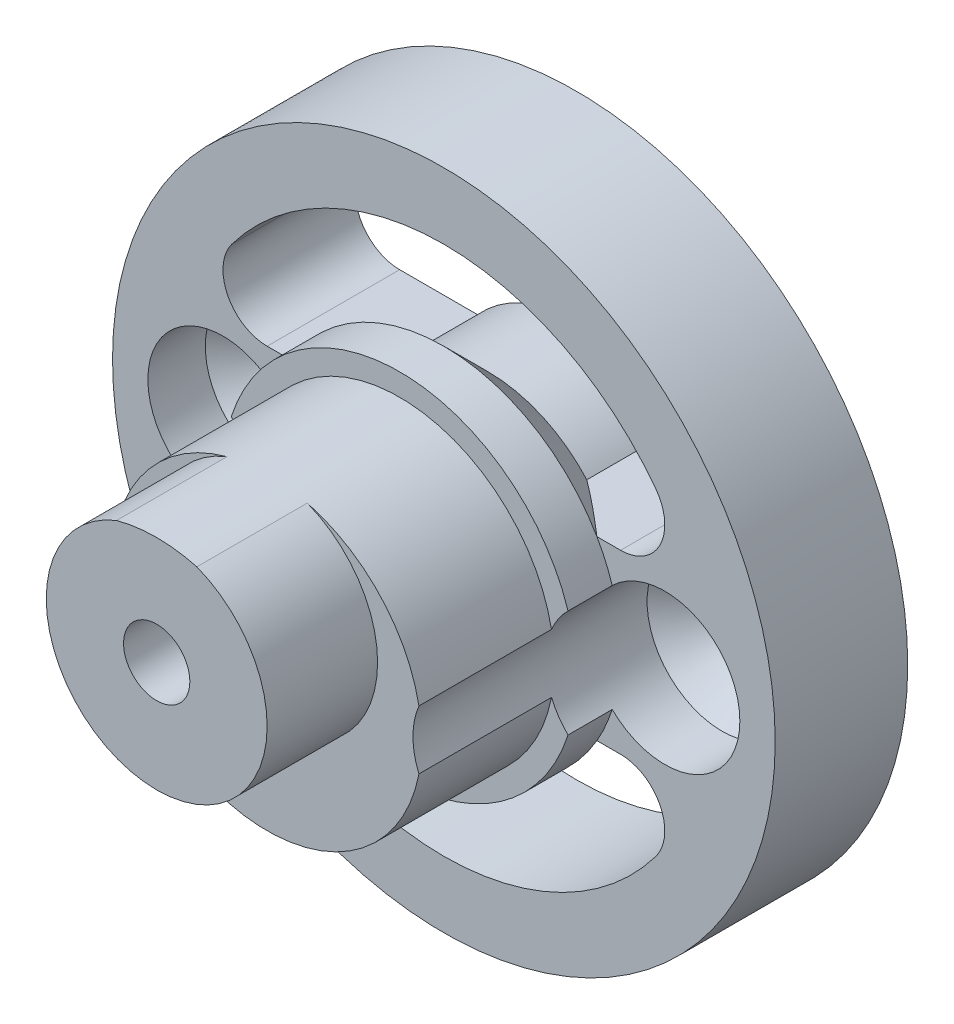
ISO-10303-21;
HEADER;
FILE_DESCRIPTION(('STEP AP214'),'2;1');
FILE_NAME('part.step','',(''),(''),'','','');
FILE_SCHEMA(('AUTOMOTIVE_DESIGN { 1 0 10303 214 1 1 1 1 }'));
ENDSEC;
DATA;
#1=APPLICATION_CONTEXT('core data for automotive mechanical design processes');
#2=APPLICATION_PROTOCOL_DEFINITION('international standard','automotive_design',2000,#1);
#3=PRODUCT_CONTEXT('',#1,'mechanical');
#4=PRODUCT('Part','Part','',(#3));
#5=PRODUCT_RELATED_PRODUCT_CATEGORY('part','',(#4));
#6=PRODUCT_DEFINITION_FORMATION('','',#4);
#7=PRODUCT_DEFINITION_CONTEXT('part definition',#1,'design');
#8=PRODUCT_DEFINITION('design','',#6,#7);
#9=PRODUCT_DEFINITION_SHAPE('','',#8);
#10=(LENGTH_UNIT() NAMED_UNIT(*) SI_UNIT(.MILLI.,.METRE.));
#11=(NAMED_UNIT(*) PLANE_ANGLE_UNIT() SI_UNIT($,.RADIAN.));
#12=(NAMED_UNIT(*) SI_UNIT($,.STERADIAN.) SOLID_ANGLE_UNIT());
#13=UNCERTAINTY_MEASURE_WITH_UNIT(LENGTH_MEASURE(1.E-05),#10,'distance_accuracy_value','');
#14=(GEOMETRIC_REPRESENTATION_CONTEXT(3) GLOBAL_UNCERTAINTY_ASSIGNED_CONTEXT((#13)) GLOBAL_UNIT_ASSIGNED_CONTEXT((#10,
#11,#12)) REPRESENTATION_CONTEXT('',''));
#15=CARTESIAN_POINT('',(0.,0.,0.));
#16=DIRECTION('',(0.,0.,1.));
#17=DIRECTION('',(1.,0.,0.));
#18=AXIS2_PLACEMENT_3D('',#15,#16,#17);
#19=CARTESIAN_POINT('',(9.30072098534997,1.08290641848162,1009.50000000001));
#20=DIRECTION('',(0.,0.,-1.));
#21=DIRECTION('',(-0.840442558877543,-0.541900641471633,0.));
#22=AXIS2_PLACEMENT_3D('',#19,#20,#21);
#23=PLANE('',#22);
#24=CARTESIAN_POINT('',(9.30072098534997,1.08290641848162,1009.50000000001));
#25=DIRECTION('',(0.,0.,-1.));
#26=DIRECTION('',(-0.840442558877543,-0.541900641471633,0.));
#27=AXIS2_PLACEMENT_3D('',#24,#25,#26);
#28=CIRCLE('',#27,0.75);
#29=CARTESIAN_POINT('',(8.67038906619181,0.676480937377897,1009.50000000001));
#30=VERTEX_POINT('',#29);
#31=EDGE_CURVE('E543',#30,#30,#28,.T.);
#32=ORIENTED_EDGE('',*,*,#31,.T.);
#33=EDGE_LOOP('',(#32));
#34=FACE_BOUND('',#33,.T.);
#35=CARTESIAN_POINT('',(9.30072098534997,0.0319064184816217,1009.50000000001));
#36=DIRECTION('',(0.,0.,-1.));
#37=DIRECTION('',(-1.,0.,0.));
#38=AXIS2_PLACEMENT_3D('',#35,#36,#37);
#39=CIRCLE('',#38,3.5);
#40=CARTESIAN_POINT('',(8.39181431475186,3.41183077623614,1009.50000000001));
#41=VERTEX_POINT('',#40);
#42=CARTESIAN_POINT('',(10.2096276559481,3.41183077623614,1009.50000000001));
#43=VERTEX_POINT('',#42);
#44=EDGE_CURVE('E604',#41,#43,#39,.T.);
#45=ORIENTED_EDGE('',*,*,#44,.F.);
#46=CARTESIAN_POINT('',(9.30072098534997,1.08290641848162,1009.50000000001));
#47=DIRECTION('',(0.,0.,-1.));
#48=DIRECTION('',(-0.840442558877543,-0.541900641471633,0.));
#49=AXIS2_PLACEMENT_3D('',#46,#47,#48);
#50=CIRCLE('',#49,2.5);
#51=EDGE_CURVE('E550',#43,#41,#50,.T.);
#52=ORIENTED_EDGE('',*,*,#51,.F.);
#53=EDGE_LOOP('',(#45,#52));
#54=FACE_BOUND('',#53,.T.);
#55=ADVANCED_FACE('F43',(#34,#54),#23,.F.);
#56=CARTESIAN_POINT('',(9.30072098534997,1.08290641848162,1007.00000000001));
#57=DIRECTION('',(0.,0.,1.));
#58=DIRECTION('',(0.840442558877543,0.541900641471633,0.));
#59=AXIS2_PLACEMENT_3D('',#56,#57,#58);
#60=CYLINDRICAL_SURFACE('',#59,2.5);
#61=DIRECTION('',(0.,0.,-1.));
#62=VECTOR('',#61,1.);
#63=CARTESIAN_POINT('',(10.2096276559481,3.41183077623614,1012.50000000001));
#64=LINE('',#63,#62);
#65=CARTESIAN_POINT('',(10.2096276559481,3.41183077623614,1007.00000000001));
#66=VERTEX_POINT('',#65);
#67=EDGE_CURVE('E204',#43,#66,#64,.T.);
#68=ORIENTED_EDGE('',*,*,#67,.F.);
#69=ORIENTED_EDGE('',*,*,#51,.T.);
#70=DIRECTION('',(0.,0.,-1.));
#71=VECTOR('',#70,1.);
#72=CARTESIAN_POINT('',(8.39181431475187,3.41183077623614,1012.50000000001));
#73=LINE('',#72,#71);
#74=CARTESIAN_POINT('',(8.39181431475186,3.41183077623614,1007.00000000001));
#75=VERTEX_POINT('',#74);
#76=EDGE_CURVE('E485',#75,#41,#73,.F.);
#77=ORIENTED_EDGE('',*,*,#76,.F.);
#78=CARTESIAN_POINT('',(9.30072098534997,1.08290641848162,1007.00000000001));
#79=DIRECTION('',(0.,0.,-1.));
#80=DIRECTION('',(-0.840442558877543,-0.541900641471633,0.));
#81=AXIS2_PLACEMENT_3D('',#78,#79,#80);
#82=CIRCLE('',#81,2.5);
#83=EDGE_CURVE('E483',#66,#75,#82,.T.);
#84=ORIENTED_EDGE('',*,*,#83,.F.);
#85=EDGE_LOOP('',(#68,#69,#77,#84));
#86=FACE_BOUND('',#85,.T.);
#87=ADVANCED_FACE('F218',(#86),#60,.T.);
#88=CARTESIAN_POINT('',(9.30072098534997,0.0319064184816217,1004.00000000001));
#89=DIRECTION('',(0.,0.,1.));
#90=DIRECTION('',(1.,0.,0.));
#91=AXIS2_PLACEMENT_3D('',#88,#89,#90);
#92=CYLINDRICAL_SURFACE('',#91,3.5);
#93=CARTESIAN_POINT('',(9.30072098534997,0.0319064184816217,1007.00000000001));
#94=DIRECTION('',(0.,0.,1.));
#95=DIRECTION('',(1.,0.,0.));
#96=AXIS2_PLACEMENT_3D('',#93,#94,#95);
#97=CIRCLE('',#96,3.5);
#98=CARTESIAN_POINT('',(5.86472098534997,-0.634354791555404,1007.00000000001));
#99=VERTEX_POINT('',#98);
#100=CARTESIAN_POINT('',(12.73672098535,-0.6343547915554,1007.00000000001));
#101=VERTEX_POINT('',#100);
#102=EDGE_CURVE('E551',#99,#101,#97,.T.);
#103=ORIENTED_EDGE('',*,*,#102,.F.);
#104=DIRECTION('',(0.,0.,-1.));
#105=VECTOR('',#104,1.);
#106=CARTESIAN_POINT('',(5.86472098534997,-0.634354791555404,1008.50000000001));
#107=LINE('',#106,#105);
#108=CARTESIAN_POINT('',(5.86472098534997,-0.634354791555404,1004.00000000001));
#109=VERTEX_POINT('',#108);
#110=EDGE_CURVE('E575',#99,#109,#107,.T.);
#111=ORIENTED_EDGE('',*,*,#110,.T.);
#112=CARTESIAN_POINT('',(9.30072098534997,0.0319064184816217,1004.00000000001));
#113=DIRECTION('',(0.,0.,-1.));
#114=DIRECTION('',(-1.,0.,0.));
#115=AXIS2_PLACEMENT_3D('',#112,#113,#114);
#116=CIRCLE('',#115,3.5);
#117=CARTESIAN_POINT('',(12.73672098535,-0.6343547915554,1004.00000000001));
#118=VERTEX_POINT('',#117);
#119=EDGE_CURVE('E539',#109,#118,#116,.F.);
#120=ORIENTED_EDGE('',*,*,#119,.T.);
#121=DIRECTION('',(0.,0.,-1.));
#122=VECTOR('',#121,1.);
#123=CARTESIAN_POINT('',(12.73672098535,-0.634354791555401,1008.50000000001));
#124=LINE('',#123,#122);
#125=EDGE_CURVE('E574',#118,#101,#124,.F.);
#126=ORIENTED_EDGE('',*,*,#125,.T.);
#127=EDGE_LOOP('',(#103,#111,#120,#126));
#128=FACE_BOUND('',#127,.T.);
#129=ADVANCED_FACE('F228',(#128),#92,.T.);
#130=CARTESIAN_POINT('',(12.73672098535,0.698167628518644,1004.00000000001));
#131=VERTEX_POINT('',#130);
#132=CARTESIAN_POINT('',(5.86472098534997,0.698167628518648,1004.00000000001));
#133=VERTEX_POINT('',#132);
#134=EDGE_CURVE('E534',#131,#133,#116,.F.);
#135=ORIENTED_EDGE('',*,*,#134,.T.);
#136=DIRECTION('',(0.,0.,-1.));
#137=VECTOR('',#136,1.);
#138=CARTESIAN_POINT('',(5.86472098534997,0.698167628518647,1008.50000000001));
#139=LINE('',#138,#137);
#140=CARTESIAN_POINT('',(5.86472098534997,0.698167628518648,1007.00000000001));
#141=VERTEX_POINT('',#140);
#142=EDGE_CURVE('E593',#133,#141,#139,.F.);
#143=ORIENTED_EDGE('',*,*,#142,.T.);
#144=EDGE_CURVE('E553',#75,#141,#97,.T.);
#145=ORIENTED_EDGE('',*,*,#144,.F.);
#146=ORIENTED_EDGE('',*,*,#76,.T.);
#147=ORIENTED_EDGE('',*,*,#44,.T.);
#148=ORIENTED_EDGE('',*,*,#67,.T.);
#149=CARTESIAN_POINT('',(12.73672098535,0.698167628518644,1007.00000000001));
#150=VERTEX_POINT('',#149);
#151=EDGE_CURVE('E555',#150,#66,#97,.T.);
#152=ORIENTED_EDGE('',*,*,#151,.F.);
#153=DIRECTION('',(0.,0.,-1.));
#154=VECTOR('',#153,1.);
#155=CARTESIAN_POINT('',(12.73672098535,0.698167628518644,1008.50000000001));
#156=LINE('',#155,#154);
#157=EDGE_CURVE('E578',#150,#131,#156,.T.);
#158=ORIENTED_EDGE('',*,*,#157,.T.);
#159=EDGE_LOOP('',(#135,#143,#145,#146,#147,#148,#152,#158));
#160=FACE_BOUND('',#159,.T.);
#161=ADVANCED_FACE('F240',(#160),#92,.T.);
#162=CARTESIAN_POINT('',(9.30072098534997,0.0319064184816217,1004.00000000001));
#163=DIRECTION('',(0.,0.,-1.));
#164=DIRECTION('',(-1.,0.,0.));
#165=AXIS2_PLACEMENT_3D('',#162,#163,#164);
#166=PLANE('',#165);
#167=CARTESIAN_POINT('',(4.30072098534997,0.0319064184816217,1004.00000000001));
#168=DIRECTION('',(0.,0.,-1.));
#169=DIRECTION('',(-1.,0.,0.));
#170=AXIS2_PLACEMENT_3D('',#167,#168,#169);
#171=CIRCLE('',#170,1.7);
#172=CARTESIAN_POINT('',(5.48972098534997,-1.18311580353738,1004.00000000001));
#173=VERTEX_POINT('',#172);
#174=EDGE_CURVE('E592',#173,#109,#171,.F.);
#175=ORIENTED_EDGE('',*,*,#174,.F.);
#176=CARTESIAN_POINT('',(9.30072098534997,0.0319064184816217,1004.00000000001));
#177=DIRECTION('',(0.,0.,-1.));
#178=DIRECTION('',(-1.,0.,0.));
#179=AXIS2_PLACEMENT_3D('',#176,#177,#178);
#180=CIRCLE('',#179,4.);
#181=CARTESIAN_POINT('',(13.11172098535,-1.18311580353738,1004.00000000001));
#182=VERTEX_POINT('',#181);
#183=EDGE_CURVE('E537',#182,#173,#180,.T.);
#184=ORIENTED_EDGE('',*,*,#183,.F.);
#185=CARTESIAN_POINT('',(14.30072098535,0.0319064184816217,1004.00000000001));
#186=DIRECTION('',(0.,0.,-1.));
#187=DIRECTION('',(-1.,0.,0.));
#188=AXIS2_PLACEMENT_3D('',#185,#186,#187);
#189=CIRCLE('',#188,1.7);
#190=EDGE_CURVE('E577',#118,#182,#189,.F.);
#191=ORIENTED_EDGE('',*,*,#190,.F.);
#192=ORIENTED_EDGE('',*,*,#119,.F.);
#193=EDGE_LOOP('',(#175,#184,#191,#192));
#194=FACE_BOUND('',#193,.T.);
#195=ADVANCED_FACE('F601',(#194),#166,.F.);
#196=CARTESIAN_POINT('',(9.30072098534997,0.0319064184816217,1003.00000000001));
#197=DIRECTION('',(0.,0.,1.));
#198=DIRECTION('',(1.,0.,0.));
#199=AXIS2_PLACEMENT_3D('',#196,#197,#198);
#200=CYLINDRICAL_SURFACE('',#199,4.);
#201=DIRECTION('',(0.,0.,-1.));
#202=VECTOR('',#201,1.);
#203=CARTESIAN_POINT('',(5.48972098534997,-1.18311580353738,1008.50000000001));
#204=LINE('',#203,#202);
#205=CARTESIAN_POINT('',(5.48972098534997,-1.18311580353738,1003.00000000001));
#206=VERTEX_POINT('',#205);
#207=EDGE_CURVE('E521',#206,#173,#204,.F.);
#208=ORIENTED_EDGE('',*,*,#207,.F.);
#209=CARTESIAN_POINT('',(9.30072098534997,0.0319064184816217,1003.00000000001));
#210=DIRECTION('',(0.,0.,-1.));
#211=DIRECTION('',(-1.,0.,0.));
#212=AXIS2_PLACEMENT_3D('',#209,#210,#211);
#213=CIRCLE('',#212,4.);
#214=CARTESIAN_POINT('',(5.83661937021221,-1.96809358151838,1003.00000000001));
#215=VERTEX_POINT('',#214);
#216=EDGE_CURVE('E519',#215,#206,#213,.T.);
#217=ORIENTED_EDGE('',*,*,#216,.F.);
#218=CARTESIAN_POINT('',(12.7648226004877,-1.96809358151838,1003.00000000001));
#219=VERTEX_POINT('',#218);
#220=EDGE_CURVE('E525',#219,#215,#213,.T.);
#221=ORIENTED_EDGE('',*,*,#220,.F.);
#222=CARTESIAN_POINT('',(13.11172098535,-1.18311580353738,1003.00000000001));
#223=VERTEX_POINT('',#222);
#224=EDGE_CURVE('E529',#223,#219,#213,.T.);
#225=ORIENTED_EDGE('',*,*,#224,.F.);
#226=DIRECTION('',(0.,0.,-1.));
#227=VECTOR('',#226,1.);
#228=CARTESIAN_POINT('',(13.11172098535,-1.18311580353738,1008.50000000001));
#229=LINE('',#228,#227);
#230=EDGE_CURVE('E576',#182,#223,#229,.T.);
#231=ORIENTED_EDGE('',*,*,#230,.F.);
#232=ORIENTED_EDGE('',*,*,#183,.T.);
#233=EDGE_LOOP('',(#208,#217,#221,#225,#231,#232));
#234=FACE_BOUND('',#233,.T.);
#235=ADVANCED_FACE('F517',(#234),#200,.T.);
#236=DIRECTION('',(0.,0.,-1.));
#237=VECTOR('',#236,1.);
#238=CARTESIAN_POINT('',(5.48972098534997,1.24692864050063,1008.50000000001));
#239=LINE('',#238,#237);
#240=CARTESIAN_POINT('',(5.48972098534997,1.24692864050063,1004.00000000001));
#241=VERTEX_POINT('',#240);
#242=CARTESIAN_POINT('',(5.48972098534997,1.24692864050063,1003.00000000001));
#243=VERTEX_POINT('',#242);
#244=EDGE_CURVE('E589',#241,#243,#239,.T.);
#245=ORIENTED_EDGE('',*,*,#244,.F.);
#246=CARTESIAN_POINT('',(13.11172098535,1.24692864050063,1004.00000000001));
#247=VERTEX_POINT('',#246);
#248=EDGE_CURVE('E528',#241,#247,#180,.T.);
#249=ORIENTED_EDGE('',*,*,#248,.T.);
#250=DIRECTION('',(0.,0.,-1.));
#251=VECTOR('',#250,1.);
#252=CARTESIAN_POINT('',(13.11172098535,1.24692864050063,1008.50000000001));
#253=LINE('',#252,#251);
#254=CARTESIAN_POINT('',(13.11172098535,1.24692864050063,1003.00000000001));
#255=VERTEX_POINT('',#254);
#256=EDGE_CURVE('E590',#255,#247,#253,.F.);
#257=ORIENTED_EDGE('',*,*,#256,.F.);
#258=CARTESIAN_POINT('',(12.7648226004877,2.03190641848162,1003.00000000001));
#259=VERTEX_POINT('',#258);
#260=EDGE_CURVE('E533',#259,#255,#213,.T.);
#261=ORIENTED_EDGE('',*,*,#260,.F.);
#262=CARTESIAN_POINT('',(5.83661937021221,2.03190641848162,1003.00000000001));
#263=VERTEX_POINT('',#262);
#264=EDGE_CURVE('E532',#263,#259,#213,.T.);
#265=ORIENTED_EDGE('',*,*,#264,.F.);
#266=EDGE_CURVE('E526',#243,#263,#213,.T.);
#267=ORIENTED_EDGE('',*,*,#266,.F.);
#268=EDGE_LOOP('',(#245,#249,#257,#261,#265,#267));
#269=FACE_BOUND('',#268,.T.);
#270=ADVANCED_FACE('F337',(#269),#200,.T.);
#271=CARTESIAN_POINT('',(9.30072098534997,0.0319064184816217,1007.00000000001));
#272=DIRECTION('',(0.,0.,1.));
#273=DIRECTION('',(1.,0.,0.));
#274=AXIS2_PLACEMENT_3D('',#271,#272,#273);
#275=PLANE('',#274);
#276=ORIENTED_EDGE('',*,*,#144,.T.);
#277=CARTESIAN_POINT('',(4.30072098534997,0.0319064184816217,1007.00000000001));
#278=DIRECTION('',(0.,0.,1.));
#279=DIRECTION('',(1.,0.,0.));
#280=AXIS2_PLACEMENT_3D('',#277,#278,#279);
#281=CIRCLE('',#280,1.7);
#282=EDGE_CURVE('E569',#141,#99,#281,.F.);
#283=ORIENTED_EDGE('',*,*,#282,.T.);
#284=ORIENTED_EDGE('',*,*,#102,.T.);
#285=CARTESIAN_POINT('',(14.30072098535,0.0319064184816217,1007.00000000001));
#286=DIRECTION('',(0.,0.,1.));
#287=DIRECTION('',(1.,0.,0.));
#288=AXIS2_PLACEMENT_3D('',#285,#286,#287);
#289=CIRCLE('',#288,1.7);
#290=EDGE_CURVE('E566',#101,#150,#289,.F.);
#291=ORIENTED_EDGE('',*,*,#290,.T.);
#292=ORIENTED_EDGE('',*,*,#151,.T.);
#293=ORIENTED_EDGE('',*,*,#83,.T.);
#294=EDGE_LOOP('',(#276,#283,#284,#291,#292,#293));
#295=FACE_BOUND('',#294,.T.);
#296=ADVANCED_FACE('F340',(#295),#275,.T.);
#297=CARTESIAN_POINT('',(9.30072098534997,1.08290641848162,1007.00000000001));
#298=DIRECTION('',(0.,0.,1.));
#299=DIRECTION('',(0.840442558877543,0.541900641471633,0.));
#300=AXIS2_PLACEMENT_3D('',#297,#298,#299);
#301=CYLINDRICAL_SURFACE('',#300,0.75);
#302=CARTESIAN_POINT('',(9.30072098534997,1.08290641848162,1007.00000000001));
#303=DIRECTION('',(0.,0.,-1.));
#304=DIRECTION('',(-0.840442558877543,-0.541900641471633,0.));
#305=AXIS2_PLACEMENT_3D('',#302,#303,#304);
#306=CIRCLE('',#305,0.75);
#307=CARTESIAN_POINT('',(8.67038906619181,0.676480937377897,1007.00000000001));
#308=VERTEX_POINT('',#307);
#309=EDGE_CURVE('E481',#308,#308,#306,.T.);
#310=ORIENTED_EDGE('',*,*,#309,.T.);
#311=EDGE_LOOP('',(#310));
#312=FACE_BOUND('',#311,.T.);
#313=ORIENTED_EDGE('',*,*,#31,.F.);
#314=EDGE_LOOP('',(#313));
#315=FACE_BOUND('',#314,.T.);
#316=ADVANCED_FACE('F235',(#312,#315),#301,.F.);
#317=ORIENTED_EDGE('',*,*,#309,.F.);
#318=EDGE_LOOP('',(#317));
#319=FACE_BOUND('',#318,.T.);
#320=ADVANCED_FACE('F345',(#319),#275,.T.);
#321=EDGE_CURVE('E591',#133,#241,#171,.F.);
#322=ORIENTED_EDGE('',*,*,#321,.F.);
#323=ORIENTED_EDGE('',*,*,#134,.F.);
#324=EDGE_CURVE('E582',#247,#131,#189,.F.);
#325=ORIENTED_EDGE('',*,*,#324,.F.);
#326=ORIENTED_EDGE('',*,*,#248,.F.);
#327=EDGE_LOOP('',(#322,#323,#325,#326));
#328=FACE_BOUND('',#327,.T.);
#329=ADVANCED_FACE('F617',(#328),#166,.F.);
#330=CARTESIAN_POINT('',(4.30072098534997,0.0319064184816217,1000.00000000001));
#331=DIRECTION('',(0.,0.,1.));
#332=DIRECTION('',(1.,0.,0.));
#333=AXIS2_PLACEMENT_3D('',#330,#331,#332);
#334=CYLINDRICAL_SURFACE('',#333,1.);
#335=CARTESIAN_POINT('',(4.30072098534997,0.0319064184816217,1000.00000000001));
#336=DIRECTION('',(0.,0.,-1.));
#337=DIRECTION('',(-1.,0.,0.));
#338=AXIS2_PLACEMENT_3D('',#335,#336,#337);
#339=CIRCLE('',#338,1.);
#340=CARTESIAN_POINT('',(3.30072098534997,0.0319064184816217,1000.00000000001));
#341=VERTEX_POINT('',#340);
#342=EDGE_CURVE('E407',#341,#341,#339,.T.);
#343=ORIENTED_EDGE('',*,*,#342,.T.);
#344=EDGE_LOOP('',(#343));
#345=FACE_BOUND('',#344,.T.);
#346=CARTESIAN_POINT('',(4.30072098534997,0.0319064184816217,1001.00000000001));
#347=DIRECTION('',(0.,0.,1.));
#348=DIRECTION('',(1.,0.,0.));
#349=AXIS2_PLACEMENT_3D('',#346,#347,#348);
#350=CIRCLE('',#349,0.999999999999997);
#351=CARTESIAN_POINT('',(5.30072098534997,0.0319064184816217,1001.00000000001));
#352=VERTEX_POINT('',#351);
#353=EDGE_CURVE('E372',#352,#352,#350,.F.);
#354=ORIENTED_EDGE('',*,*,#353,.F.);
#355=EDGE_LOOP('',(#354));
#356=FACE_BOUND('',#355,.T.);
#357=ADVANCED_FACE('F368',(#345,#356),#334,.F.);
#358=CARTESIAN_POINT('',(14.30072098535,0.0319064184816217,1000.00000000001));
#359=DIRECTION('',(0.,0.,1.));
#360=DIRECTION('',(1.,0.,0.));
#361=AXIS2_PLACEMENT_3D('',#358,#359,#360);
#362=CYLINDRICAL_SURFACE('',#361,1.);
#363=CARTESIAN_POINT('',(14.30072098535,0.0319064184816217,1000.00000000001));
#364=DIRECTION('',(0.,0.,-1.));
#365=DIRECTION('',(-1.,0.,0.));
#366=AXIS2_PLACEMENT_3D('',#363,#364,#365);
#367=CIRCLE('',#366,1.);
#368=CARTESIAN_POINT('',(13.30072098535,0.0319064184816217,1000.00000000001));
#369=VERTEX_POINT('',#368);
#370=EDGE_CURVE('E413',#369,#369,#367,.T.);
#371=ORIENTED_EDGE('',*,*,#370,.T.);
#372=EDGE_LOOP('',(#371));
#373=FACE_BOUND('',#372,.T.);
#374=CARTESIAN_POINT('',(14.30072098535,0.0319064184816217,1001.00000000001));
#375=DIRECTION('',(0.,0.,1.));
#376=DIRECTION('',(1.,0.,0.));
#377=AXIS2_PLACEMENT_3D('',#374,#375,#376);
#378=CIRCLE('',#377,0.999999999999999);
#379=CARTESIAN_POINT('',(15.30072098535,0.0319064184816217,1001.00000000001));
#380=VERTEX_POINT('',#379);
#381=EDGE_CURVE('E376',#380,#380,#378,.F.);
#382=ORIENTED_EDGE('',*,*,#381,.F.);
#383=EDGE_LOOP('',(#382));
#384=FACE_BOUND('',#383,.T.);
#385=ADVANCED_FACE('F315',(#373,#384),#362,.F.);
#386=CARTESIAN_POINT('',(4.30072098534997,0.0319064184816217,1001.00000000001));
#387=DIRECTION('',(0.,0.,1.));
#388=DIRECTION('',(1.,0.,0.));
#389=AXIS2_PLACEMENT_3D('',#386,#387,#388);
#390=CONICAL_SURFACE('',#389,0.999999999999992,0.785398163397454);
#391=CARTESIAN_POINT('',(4.30072098534997,0.0319064184816217,1001.70000000001));
#392=DIRECTION('',(0.,0.,1.));
#393=DIRECTION('',(1.,0.,0.));
#394=AXIS2_PLACEMENT_3D('',#391,#392,#393);
#395=CIRCLE('',#394,1.7);
#396=CARTESIAN_POINT('',(6.00072098534997,0.0319064184816217,1001.70000000001));
#397=VERTEX_POINT('',#396);
#398=EDGE_CURVE('E371',#397,#397,#395,.F.);
#399=ORIENTED_EDGE('',*,*,#398,.F.);
#400=EDGE_LOOP('',(#399));
#401=FACE_BOUND('',#400,.T.);
#402=ORIENTED_EDGE('',*,*,#353,.T.);
#403=EDGE_LOOP('',(#402));
#404=FACE_BOUND('',#403,.T.);
#405=ADVANCED_FACE('F352',(#401,#404),#390,.F.);
#406=CARTESIAN_POINT('',(14.30072098535,0.0319064184816217,1001.00000000001));
#407=DIRECTION('',(0.,0.,1.));
#408=DIRECTION('',(1.,0.,0.));
#409=AXIS2_PLACEMENT_3D('',#406,#407,#408);
#410=CONICAL_SURFACE('',#409,0.999999999999992,0.785398163397454);
#411=CARTESIAN_POINT('',(14.30072098535,0.0319064184816217,1001.70000000001));
#412=DIRECTION('',(0.,0.,1.));
#413=DIRECTION('',(1.,0.,0.));
#414=AXIS2_PLACEMENT_3D('',#411,#412,#413);
#415=CIRCLE('',#414,1.7);
#416=CARTESIAN_POINT('',(16.00072098535,0.0319064184816217,1001.70000000001));
#417=VERTEX_POINT('',#416);
#418=EDGE_CURVE('E476',#417,#417,#415,.F.);
#419=ORIENTED_EDGE('',*,*,#418,.F.);
#420=EDGE_LOOP('',(#419));
#421=FACE_BOUND('',#420,.T.);
#422=ORIENTED_EDGE('',*,*,#381,.T.);
#423=EDGE_LOOP('',(#422));
#424=FACE_BOUND('',#423,.T.);
#425=ADVANCED_FACE('F288',(#421,#424),#410,.F.);
#426=CARTESIAN_POINT('',(5.30072098534997,-2.96809358151838,1000.00000000001));
#427=DIRECTION('',(0.,0.,1.));
#428=DIRECTION('',(1.,0.,0.));
#429=AXIS2_PLACEMENT_3D('',#426,#427,#428);
#430=CYLINDRICAL_SURFACE('',#429,1.);
#431=CARTESIAN_POINT('',(5.30072098534997,-2.96809358151838,1000.00000000001));
#432=DIRECTION('',(0.,0.,-1.));
#433=DIRECTION('',(-1.,0.,0.));
#434=AXIS2_PLACEMENT_3D('',#431,#432,#433);
#435=CIRCLE('',#434,1.);
#436=CARTESIAN_POINT('',(5.30072098534997,-1.96809358151838,1000.00000000001));
#437=VERTEX_POINT('',#436);
#438=CARTESIAN_POINT('',(4.50072098534997,-3.56809358151838,1000.00000000001));
#439=VERTEX_POINT('',#438);
#440=EDGE_CURVE('E474',#437,#439,#435,.F.);
#441=ORIENTED_EDGE('',*,*,#440,.F.);
#442=DIRECTION('',(0.,0.,-1.));
#443=VECTOR('',#442,1.);
#444=CARTESIAN_POINT('',(5.30072098534997,-1.96809358151838,1000.00000000001));
#445=LINE('',#444,#443);
#446=CARTESIAN_POINT('',(5.30072098534997,-1.96809358151838,1003.00000000001));
#447=VERTEX_POINT('',#446);
#448=EDGE_CURVE('E459',#447,#437,#445,.T.);
#449=ORIENTED_EDGE('',*,*,#448,.F.);
#450=CARTESIAN_POINT('',(5.30072098534997,-2.96809358151838,1003.00000000001));
#451=DIRECTION('',(0.,0.,-1.));
#452=DIRECTION('',(-1.,0.,0.));
#453=AXIS2_PLACEMENT_3D('',#450,#451,#452);
#454=CIRCLE('',#453,1.);
#455=CARTESIAN_POINT('',(4.50072098534997,-3.56809358151838,1003.00000000001));
#456=VERTEX_POINT('',#455);
#457=EDGE_CURVE('E471',#456,#447,#454,.T.);
#458=ORIENTED_EDGE('',*,*,#457,.F.);
#459=DIRECTION('',(0.,0.,1.));
#460=VECTOR('',#459,1.);
#461=CARTESIAN_POINT('',(4.50072098534997,-3.56809358151838,1000.00000000001));
#462=LINE('',#461,#460);
#463=EDGE_CURVE('E441',#439,#456,#462,.T.);
#464=ORIENTED_EDGE('',*,*,#463,.F.);
#465=EDGE_LOOP('',(#441,#449,#458,#464));
#466=FACE_BOUND('',#465,.T.);
#467=ADVANCED_FACE('F323',(#466),#430,.F.);
#468=CARTESIAN_POINT('',(9.30072098534997,0.0319064184816217,1000.00000000001));
#469=DIRECTION('',(0.,0.,1.));
#470=DIRECTION('',(1.,0.,0.));
#471=AXIS2_PLACEMENT_3D('',#468,#469,#470);
#472=CYLINDRICAL_SURFACE('',#471,6.);
#473=CARTESIAN_POINT('',(9.30072098534997,0.0319064184816217,1003.00000000001));
#474=DIRECTION('',(0.,0.,-1.));
#475=DIRECTION('',(-1.,0.,0.));
#476=AXIS2_PLACEMENT_3D('',#473,#474,#475);
#477=CIRCLE('',#476,6.);
#478=CARTESIAN_POINT('',(14.10072098535,-3.56809358151838,1003.00000000001));
#479=VERTEX_POINT('',#478);
#480=EDGE_CURVE('E418',#479,#456,#477,.T.);
#481=ORIENTED_EDGE('',*,*,#480,.F.);
#482=DIRECTION('',(0.,0.,1.));
#483=VECTOR('',#482,1.);
#484=CARTESIAN_POINT('',(14.10072098535,-3.56809358151838,1000.00000000001));
#485=LINE('',#484,#483);
#486=CARTESIAN_POINT('',(14.10072098535,-3.56809358151838,1000.00000000001));
#487=VERTEX_POINT('',#486);
#488=EDGE_CURVE('E450',#479,#487,#485,.F.);
#489=ORIENTED_EDGE('',*,*,#488,.T.);
#490=CARTESIAN_POINT('',(9.30072098534997,0.0319064184816217,1000.00000000001));
#491=DIRECTION('',(0.,0.,-1.));
#492=DIRECTION('',(-1.,0.,0.));
#493=AXIS2_PLACEMENT_3D('',#490,#491,#492);
#494=CIRCLE('',#493,6.);
#495=EDGE_CURVE('E417',#487,#439,#494,.T.);
#496=ORIENTED_EDGE('',*,*,#495,.T.);
#497=ORIENTED_EDGE('',*,*,#463,.T.);
#498=EDGE_LOOP('',(#481,#489,#496,#497));
#499=FACE_BOUND('',#498,.T.);
#500=ADVANCED_FACE('F317',(#499),#472,.F.);
#501=CARTESIAN_POINT('',(13.30072098535,-2.96809358151838,1000.00000000001));
#502=DIRECTION('',(0.,0.,1.));
#503=DIRECTION('',(1.,0.,0.));
#504=AXIS2_PLACEMENT_3D('',#501,#502,#503);
#505=CYLINDRICAL_SURFACE('',#504,1.);
#506=CARTESIAN_POINT('',(13.30072098535,-2.96809358151838,1000.00000000001));
#507=DIRECTION('',(0.,0.,-1.));
#508=DIRECTION('',(-1.,0.,0.));
#509=AXIS2_PLACEMENT_3D('',#506,#507,#508);
#510=CIRCLE('',#509,1.);
#511=CARTESIAN_POINT('',(13.30072098535,-1.96809358151838,1000.00000000001));
#512=VERTEX_POINT('',#511);
#513=EDGE_CURVE('E461',#487,#512,#510,.F.);
#514=ORIENTED_EDGE('',*,*,#513,.F.);
#515=ORIENTED_EDGE('',*,*,#488,.F.);
#516=CARTESIAN_POINT('',(13.30072098535,-2.96809358151838,1003.00000000001));
#517=DIRECTION('',(0.,0.,-1.));
#518=DIRECTION('',(-1.,0.,0.));
#519=AXIS2_PLACEMENT_3D('',#516,#517,#518);
#520=CIRCLE('',#519,1.);
#521=CARTESIAN_POINT('',(13.30072098535,-1.96809358151838,1003.00000000001));
#522=VERTEX_POINT('',#521);
#523=EDGE_CURVE('E463',#522,#479,#520,.T.);
#524=ORIENTED_EDGE('',*,*,#523,.F.);
#525=DIRECTION('',(0.,0.,-1.));
#526=VECTOR('',#525,1.);
#527=CARTESIAN_POINT('',(13.30072098535,-1.96809358151838,1003.00000000001));
#528=LINE('',#527,#526);
#529=EDGE_CURVE('E442',#512,#522,#528,.F.);
#530=ORIENTED_EDGE('',*,*,#529,.F.);
#531=EDGE_LOOP('',(#514,#515,#524,#530));
#532=FACE_BOUND('',#531,.T.);
#533=ADVANCED_FACE('F325',(#532),#505,.F.);
#534=CARTESIAN_POINT('',(13.30072098535,3.03190641848162,1000.00000000001));
#535=DIRECTION('',(0.,0.,1.));
#536=DIRECTION('',(1.,0.,0.));
#537=AXIS2_PLACEMENT_3D('',#534,#535,#536);
#538=CYLINDRICAL_SURFACE('',#537,1.);
#539=CARTESIAN_POINT('',(13.30072098535,3.03190641848162,1000.00000000001));
#540=DIRECTION('',(0.,0.,-1.));
#541=DIRECTION('',(-1.,0.,0.));
#542=AXIS2_PLACEMENT_3D('',#539,#540,#541);
#543=CIRCLE('',#542,1.);
#544=CARTESIAN_POINT('',(13.30072098535,2.03190641848162,1000.00000000001));
#545=VERTEX_POINT('',#544);
#546=CARTESIAN_POINT('',(14.10072098535,3.63190641848162,1000.00000000001));
#547=VERTEX_POINT('',#546);
#548=EDGE_CURVE('E470',#545,#547,#543,.F.);
#549=ORIENTED_EDGE('',*,*,#548,.F.);
#550=DIRECTION('',(0.,0.,-1.));
#551=VECTOR('',#550,1.);
#552=CARTESIAN_POINT('',(13.30072098535,2.03190641848162,1000.00000000001));
#553=LINE('',#552,#551);
#554=CARTESIAN_POINT('',(13.30072098535,2.03190641848162,1003.00000000001));
#555=VERTEX_POINT('',#554);
#556=EDGE_CURVE('E454',#555,#545,#553,.T.);
#557=ORIENTED_EDGE('',*,*,#556,.F.);
#558=CARTESIAN_POINT('',(13.30072098535,3.03190641848162,1003.00000000001));
#559=DIRECTION('',(0.,0.,-1.));
#560=DIRECTION('',(-1.,0.,0.));
#561=AXIS2_PLACEMENT_3D('',#558,#559,#560);
#562=CIRCLE('',#561,1.);
#563=CARTESIAN_POINT('',(14.10072098535,3.63190641848162,1003.00000000001));
#564=VERTEX_POINT('',#563);
#565=EDGE_CURVE('E462',#564,#555,#562,.T.);
#566=ORIENTED_EDGE('',*,*,#565,.F.);
#567=DIRECTION('',(0.,0.,1.));
#568=VECTOR('',#567,1.);
#569=CARTESIAN_POINT('',(14.10072098535,3.63190641848162,1000.00000000001));
#570=LINE('',#569,#568);
#571=EDGE_CURVE('E452',#547,#564,#570,.T.);
#572=ORIENTED_EDGE('',*,*,#571,.F.);
#573=EDGE_LOOP('',(#549,#557,#566,#572));
#574=FACE_BOUND('',#573,.T.);
#575=ADVANCED_FACE('F341',(#574),#538,.F.);
#576=CARTESIAN_POINT('',(9.30072098534997,0.0319064184816217,1000.00000000001));
#577=DIRECTION('',(0.,0.,1.));
#578=DIRECTION('',(1.,0.,0.));
#579=AXIS2_PLACEMENT_3D('',#576,#577,#578);
#580=CYLINDRICAL_SURFACE('',#579,6.);
#581=CARTESIAN_POINT('',(9.30072098534997,0.0319064184816217,1000.00000000001));
#582=DIRECTION('',(0.,0.,-1.));
#583=DIRECTION('',(-1.,0.,0.));
#584=AXIS2_PLACEMENT_3D('',#581,#582,#583);
#585=CIRCLE('',#584,6.);
#586=CARTESIAN_POINT('',(4.50072098534997,3.63190641848162,1000.00000000001));
#587=VERTEX_POINT('',#586);
#588=EDGE_CURVE('E391',#587,#547,#585,.T.);
#589=ORIENTED_EDGE('',*,*,#588,.T.);
#590=ORIENTED_EDGE('',*,*,#571,.T.);
#591=CARTESIAN_POINT('',(9.30072098534997,0.0319064184816217,1003.00000000001));
#592=DIRECTION('',(0.,0.,-1.));
#593=DIRECTION('',(-1.,0.,0.));
#594=AXIS2_PLACEMENT_3D('',#591,#592,#593);
#595=CIRCLE('',#594,6.);
#596=CARTESIAN_POINT('',(4.50072098534997,3.63190641848162,1003.00000000001));
#597=VERTEX_POINT('',#596);
#598=EDGE_CURVE('E396',#597,#564,#595,.T.);
#599=ORIENTED_EDGE('',*,*,#598,.F.);
#600=DIRECTION('',(0.,0.,1.));
#601=VECTOR('',#600,1.);
#602=CARTESIAN_POINT('',(4.50072098534997,3.63190641848162,1000.00000000001));
#603=LINE('',#602,#601);
#604=EDGE_CURVE('E449',#597,#587,#603,.F.);
#605=ORIENTED_EDGE('',*,*,#604,.T.);
#606=EDGE_LOOP('',(#589,#590,#599,#605));
#607=FACE_BOUND('',#606,.T.);
#608=ADVANCED_FACE('F259',(#607),#580,.F.);
#609=CARTESIAN_POINT('',(5.30072098534997,3.03190641848162,1000.00000000001));
#610=DIRECTION('',(0.,0.,1.));
#611=DIRECTION('',(1.,0.,0.));
#612=AXIS2_PLACEMENT_3D('',#609,#610,#611);
#613=CYLINDRICAL_SURFACE('',#612,1.);
#614=CARTESIAN_POINT('',(5.30072098534997,3.03190641848162,1000.00000000001));
#615=DIRECTION('',(0.,0.,-1.));
#616=DIRECTION('',(-1.,0.,0.));
#617=AXIS2_PLACEMENT_3D('',#614,#615,#616);
#618=CIRCLE('',#617,1.);
#619=CARTESIAN_POINT('',(5.30072098534997,2.03190641848162,1000.00000000001));
#620=VERTEX_POINT('',#619);
#621=EDGE_CURVE('E473',#587,#620,#618,.F.);
#622=ORIENTED_EDGE('',*,*,#621,.F.);
#623=ORIENTED_EDGE('',*,*,#604,.F.);
#624=CARTESIAN_POINT('',(5.30072098534997,3.03190641848162,1003.00000000001));
#625=DIRECTION('',(0.,0.,-1.));
#626=DIRECTION('',(-1.,0.,0.));
#627=AXIS2_PLACEMENT_3D('',#624,#625,#626);
#628=CIRCLE('',#627,1.);
#629=CARTESIAN_POINT('',(5.30072098534997,2.03190641848162,1003.00000000001));
#630=VERTEX_POINT('',#629);
#631=EDGE_CURVE('E469',#630,#597,#628,.T.);
#632=ORIENTED_EDGE('',*,*,#631,.F.);
#633=DIRECTION('',(0.,0.,-1.));
#634=VECTOR('',#633,1.);
#635=CARTESIAN_POINT('',(5.30072098534997,2.03190641848162,1003.00000000001));
#636=LINE('',#635,#634);
#637=EDGE_CURVE('E457',#620,#630,#636,.F.);
#638=ORIENTED_EDGE('',*,*,#637,.F.);
#639=EDGE_LOOP('',(#622,#623,#632,#638));
#640=FACE_BOUND('',#639,.T.);
#641=ADVANCED_FACE('F241',(#640),#613,.F.);
#642=CARTESIAN_POINT('',(9.30072098534997,0.0319064184816217,1000.00000000001));
#643=DIRECTION('',(0.,0.,1.));
#644=DIRECTION('',(1.,0.,0.));
#645=AXIS2_PLACEMENT_3D('',#642,#643,#644);
#646=CYLINDRICAL_SURFACE('',#645,7.5);
#647=CARTESIAN_POINT('',(9.30072098534997,0.0319064184816217,1000.00000000001));
#648=DIRECTION('',(0.,0.,1.));
#649=DIRECTION('',(1.,0.,0.));
#650=AXIS2_PLACEMENT_3D('',#647,#648,#649);
#651=CIRCLE('',#650,7.5);
#652=CARTESIAN_POINT('',(16.80072098535,0.0319064184816217,1000.00000000001));
#653=VERTEX_POINT('',#652);
#654=EDGE_CURVE('E558',#653,#653,#651,.T.);
#655=ORIENTED_EDGE('',*,*,#654,.T.);
#656=EDGE_LOOP('',(#655));
#657=FACE_BOUND('',#656,.T.);
#658=CARTESIAN_POINT('',(9.30072098534997,0.0319064184816217,1003.00000000001));
#659=DIRECTION('',(0.,0.,1.));
#660=DIRECTION('',(1.,0.,0.));
#661=AXIS2_PLACEMENT_3D('',#658,#659,#660);
#662=CIRCLE('',#661,7.5);
#663=CARTESIAN_POINT('',(16.80072098535,0.0319064184816217,1003.00000000001));
#664=VERTEX_POINT('',#663);
#665=EDGE_CURVE('E559',#664,#664,#662,.T.);
#666=ORIENTED_EDGE('',*,*,#665,.F.);
#667=EDGE_LOOP('',(#666));
#668=FACE_BOUND('',#667,.T.);
#669=ADVANCED_FACE('F239',(#657,#668),#646,.T.);
#670=CARTESIAN_POINT('',(9.30072098534997,0.0319064184816217,1000.00000000001));
#671=DIRECTION('',(0.,0.,-1.));
#672=DIRECTION('',(-1.,0.,0.));
#673=AXIS2_PLACEMENT_3D('',#670,#671,#672);
#674=PLANE('',#673);
#675=CARTESIAN_POINT('',(9.30072098534997,0.0319064184816217,1000.00000000001));
#676=DIRECTION('',(0.,0.,-1.));
#677=DIRECTION('',(-1.,0.,0.));
#678=AXIS2_PLACEMENT_3D('',#675,#676,#677);
#679=CIRCLE('',#678,2.);
#680=CARTESIAN_POINT('',(7.30072098534997,0.0319064184816217,1000.00000000001));
#681=VERTEX_POINT('',#680);
#682=EDGE_CURVE('E625',#681,#681,#679,.T.);
#683=ORIENTED_EDGE('',*,*,#682,.F.);
#684=EDGE_LOOP('',(#683));
#685=FACE_BOUND('',#684,.T.);
#686=ORIENTED_EDGE('',*,*,#654,.F.);
#687=EDGE_LOOP('',(#686));
#688=FACE_BOUND('',#687,.T.);
#689=ORIENTED_EDGE('',*,*,#370,.F.);
#690=EDGE_LOOP('',(#689));
#691=FACE_BOUND('',#690,.T.);
#692=DIRECTION('',(1.,0.,0.));
#693=VECTOR('',#692,1.);
#694=CARTESIAN_POINT('',(7.06465300785018,-1.96809358151838,1000.00000000001));
#695=LINE('',#694,#693);
#696=CARTESIAN_POINT('',(7.06465300785018,-1.96809358151838,1000.00000000001));
#697=VERTEX_POINT('',#696);
#698=EDGE_CURVE('E419',#437,#697,#695,.T.);
#699=ORIENTED_EDGE('',*,*,#698,.F.);
#700=ORIENTED_EDGE('',*,*,#440,.T.);
#701=ORIENTED_EDGE('',*,*,#495,.F.);
#702=ORIENTED_EDGE('',*,*,#513,.T.);
#703=DIRECTION('',(1.,0.,0.));
#704=VECTOR('',#703,1.);
#705=CARTESIAN_POINT('',(11.5367889628498,-1.96809358151838,1000.00000000001));
#706=LINE('',#705,#704);
#707=CARTESIAN_POINT('',(11.5367889628498,-1.96809358151838,1000.00000000001));
#708=VERTEX_POINT('',#707);
#709=EDGE_CURVE('E426',#708,#512,#706,.T.);
#710=ORIENTED_EDGE('',*,*,#709,.F.);
#711=CARTESIAN_POINT('',(9.30072098534997,0.0319064184816217,1000.00000000001));
#712=DIRECTION('',(0.,0.,1.));
#713=DIRECTION('',(-1.,0.,0.));
#714=AXIS2_PLACEMENT_3D('',#711,#712,#713);
#715=CIRCLE('',#714,3.);
#716=EDGE_CURVE('E421',#697,#708,#715,.T.);
#717=ORIENTED_EDGE('',*,*,#716,.F.);
#718=EDGE_LOOP('',(#699,#700,#701,#702,#710,#717));
#719=FACE_BOUND('',#718,.T.);
#720=ORIENTED_EDGE('',*,*,#342,.F.);
#721=EDGE_LOOP('',(#720));
#722=FACE_BOUND('',#721,.T.);
#723=DIRECTION('',(-1.,0.,0.));
#724=VECTOR('',#723,1.);
#725=CARTESIAN_POINT('',(7.06465300785018,2.03190641848162,1000.00000000001));
#726=LINE('',#725,#724);
#727=CARTESIAN_POINT('',(7.06465300785018,2.03190641848162,1000.00000000001));
#728=VERTEX_POINT('',#727);
#729=EDGE_CURVE('E386',#728,#620,#726,.T.);
#730=ORIENTED_EDGE('',*,*,#729,.F.);
#731=CARTESIAN_POINT('',(9.30072098534997,0.0319064184816217,1000.00000000001));
#732=DIRECTION('',(0.,0.,1.));
#733=DIRECTION('',(-1.,0.,0.));
#734=AXIS2_PLACEMENT_3D('',#731,#732,#733);
#735=CIRCLE('',#734,3.);
#736=CARTESIAN_POINT('',(11.5367889628498,2.03190641848162,1000.00000000001));
#737=VERTEX_POINT('',#736);
#738=EDGE_CURVE('E390',#737,#728,#735,.T.);
#739=ORIENTED_EDGE('',*,*,#738,.F.);
#740=DIRECTION('',(-1.,0.,0.));
#741=VECTOR('',#740,1.);
#742=CARTESIAN_POINT('',(11.5367889628498,2.03190641848162,1000.00000000001));
#743=LINE('',#742,#741);
#744=EDGE_CURVE('E397',#545,#737,#743,.T.);
#745=ORIENTED_EDGE('',*,*,#744,.F.);
#746=ORIENTED_EDGE('',*,*,#548,.T.);
#747=ORIENTED_EDGE('',*,*,#588,.F.);
#748=ORIENTED_EDGE('',*,*,#621,.T.);
#749=EDGE_LOOP('',(#730,#739,#745,#746,#747,#748));
#750=FACE_BOUND('',#749,.T.);
#751=ADVANCED_FACE('F245',(#685,#688,#691,#719,#722,#750),#674,.T.);
#752=CARTESIAN_POINT('',(9.30072098534997,0.0319064184816217,1003.00000000001));
#753=DIRECTION('',(0.,0.,1.));
#754=DIRECTION('',(1.,0.,0.));
#755=AXIS2_PLACEMENT_3D('',#752,#753,#754);
#756=CYLINDRICAL_SURFACE('',#755,3.);
#757=DIRECTION('',(0.,0.,1.));
#758=VECTOR('',#757,1.);
#759=CARTESIAN_POINT('',(11.5367889628498,-1.96809358151838,1000.00000000001));
#760=LINE('',#759,#758);
#761=CARTESIAN_POINT('',(11.5367889628498,-1.96809358151838,1002.00000000001));
#762=VERTEX_POINT('',#761);
#763=EDGE_CURVE('E427',#708,#762,#760,.T.);
#764=ORIENTED_EDGE('',*,*,#763,.T.);
#765=CARTESIAN_POINT('',(9.30072098534997,0.0319064184816217,1002.00000000001));
#766=DIRECTION('',(0.,0.,-1.));
#767=DIRECTION('',(-1.,0.,0.));
#768=AXIS2_PLACEMENT_3D('',#765,#766,#767);
#769=CIRCLE('',#768,3.);
#770=CARTESIAN_POINT('',(7.06465300785018,-1.96809358151838,1002.00000000001));
#771=VERTEX_POINT('',#770);
#772=EDGE_CURVE('E515',#762,#771,#769,.T.);
#773=ORIENTED_EDGE('',*,*,#772,.T.);
#774=DIRECTION('',(0.,0.,1.));
#775=VECTOR('',#774,1.);
#776=CARTESIAN_POINT('',(7.06465300785018,-1.96809358151838,1000.00000000001));
#777=LINE('',#776,#775);
#778=EDGE_CURVE('E437',#697,#771,#777,.T.);
#779=ORIENTED_EDGE('',*,*,#778,.F.);
#780=ORIENTED_EDGE('',*,*,#716,.T.);
#781=EDGE_LOOP('',(#764,#773,#779,#780));
#782=FACE_BOUND('',#781,.T.);
#783=ADVANCED_FACE('F330',(#782),#756,.T.);
#784=DIRECTION('',(0.,0.,1.));
#785=VECTOR('',#784,1.);
#786=CARTESIAN_POINT('',(7.06465300785018,2.03190641848162,1000.00000000001));
#787=LINE('',#786,#785);
#788=CARTESIAN_POINT('',(7.06465300785018,2.03190641848162,1002.00000000001));
#789=VERTEX_POINT('',#788);
#790=EDGE_CURVE('E410',#728,#789,#787,.T.);
#791=ORIENTED_EDGE('',*,*,#790,.T.);
#792=CARTESIAN_POINT('',(9.30072098534997,0.0319064184816217,1002.00000000001));
#793=DIRECTION('',(0.,0.,-1.));
#794=DIRECTION('',(-1.,0.,0.));
#795=AXIS2_PLACEMENT_3D('',#792,#793,#794);
#796=CIRCLE('',#795,3.);
#797=CARTESIAN_POINT('',(11.5367889628498,2.03190641848162,1002.00000000001));
#798=VERTEX_POINT('',#797);
#799=EDGE_CURVE('E271',#789,#798,#796,.T.);
#800=ORIENTED_EDGE('',*,*,#799,.T.);
#801=DIRECTION('',(0.,0.,1.));
#802=VECTOR('',#801,1.);
#803=CARTESIAN_POINT('',(11.5367889628498,2.03190641848162,1000.00000000001));
#804=LINE('',#803,#802);
#805=EDGE_CURVE('E398',#737,#798,#804,.T.);
#806=ORIENTED_EDGE('',*,*,#805,.F.);
#807=ORIENTED_EDGE('',*,*,#738,.T.);
#808=EDGE_LOOP('',(#791,#800,#806,#807));
#809=FACE_BOUND('',#808,.T.);
#810=ADVANCED_FACE('F335',(#809),#756,.T.);
#811=CARTESIAN_POINT('',(9.30072098534997,0.0319064184816217,1003.00000000001));
#812=DIRECTION('',(0.,0.,-1.));
#813=DIRECTION('',(-1.,0.,0.));
#814=AXIS2_PLACEMENT_3D('',#811,#812,#813);
#815=PLANE('',#814);
#816=ORIENTED_EDGE('',*,*,#665,.T.);
#817=EDGE_LOOP('',(#816));
#818=FACE_BOUND('',#817,.T.);
#819=CARTESIAN_POINT('',(4.30072098534997,0.0319064184816217,1003.00000000001));
#820=DIRECTION('',(0.,0.,1.));
#821=DIRECTION('',(1.,0.,0.));
#822=AXIS2_PLACEMENT_3D('',#819,#820,#821);
#823=CIRCLE('',#822,1.7);
#824=EDGE_CURVE('E380',#243,#206,#823,.T.);
#825=ORIENTED_EDGE('',*,*,#824,.F.);
#826=ORIENTED_EDGE('',*,*,#266,.T.);
#827=DIRECTION('',(-1.,0.,0.));
#828=VECTOR('',#827,1.);
#829=CARTESIAN_POINT('',(7.06465300785018,2.03190641848162,1003.00000000001));
#830=LINE('',#829,#828);
#831=EDGE_CURVE('E379',#263,#630,#830,.T.);
#832=ORIENTED_EDGE('',*,*,#831,.T.);
#833=ORIENTED_EDGE('',*,*,#631,.T.);
#834=ORIENTED_EDGE('',*,*,#598,.T.);
#835=ORIENTED_EDGE('',*,*,#565,.T.);
#836=DIRECTION('',(-1.,0.,0.));
#837=VECTOR('',#836,1.);
#838=CARTESIAN_POINT('',(11.5367889628498,2.03190641848162,1003.00000000001));
#839=LINE('',#838,#837);
#840=EDGE_CURVE('E388',#555,#259,#839,.T.);
#841=ORIENTED_EDGE('',*,*,#840,.T.);
#842=ORIENTED_EDGE('',*,*,#260,.T.);
#843=CARTESIAN_POINT('',(14.30072098535,0.0319064184816217,1003.00000000001));
#844=DIRECTION('',(0.,0.,1.));
#845=DIRECTION('',(1.,0.,0.));
#846=AXIS2_PLACEMENT_3D('',#843,#844,#845);
#847=CIRCLE('',#846,1.7);
#848=EDGE_CURVE('E382',#223,#255,#847,.T.);
#849=ORIENTED_EDGE('',*,*,#848,.F.);
#850=ORIENTED_EDGE('',*,*,#224,.T.);
#851=DIRECTION('',(1.,0.,0.));
#852=VECTOR('',#851,1.);
#853=CARTESIAN_POINT('',(11.5367889628498,-1.96809358151838,1003.00000000001));
#854=LINE('',#853,#852);
#855=EDGE_CURVE('E423',#219,#522,#854,.T.);
#856=ORIENTED_EDGE('',*,*,#855,.T.);
#857=ORIENTED_EDGE('',*,*,#523,.T.);
#858=ORIENTED_EDGE('',*,*,#480,.T.);
#859=ORIENTED_EDGE('',*,*,#457,.T.);
#860=DIRECTION('',(1.,0.,0.));
#861=VECTOR('',#860,1.);
#862=CARTESIAN_POINT('',(7.06465300785018,-1.96809358151838,1003.00000000001));
#863=LINE('',#862,#861);
#864=EDGE_CURVE('E435',#447,#215,#863,.T.);
#865=ORIENTED_EDGE('',*,*,#864,.T.);
#866=ORIENTED_EDGE('',*,*,#216,.T.);
#867=EDGE_LOOP('',(#825,#826,#832,#833,#834,#835,#841,#842,#849,#850,#856,#857,#858,#859,#865,#866));
#868=FACE_BOUND('',#867,.T.);
#869=ADVANCED_FACE('F328',(#818,#868),#815,.F.);
#870=CARTESIAN_POINT('',(7.06465300785018,2.03190641848162,1000.00000000001));
#871=DIRECTION('',(0.,1.,0.));
#872=DIRECTION('',(0.,0.,1.));
#873=AXIS2_PLACEMENT_3D('',#870,#871,#872);
#874=PLANE('',#873);
#875=ORIENTED_EDGE('',*,*,#831,.F.);
#876=CARTESIAN_POINT('',(5.83661937021211,2.03190641848162,1003.00000000001));
#877=CARTESIAN_POINT('',(5.93642328995411,2.03190641848162,1002.91359330887));
#878=CARTESIAN_POINT('',(6.03666731104462,2.03190641848162,1002.82768731859));
#879=CARTESIAN_POINT('',(6.23827708724338,2.03190641848162,1002.6572690315));
#880=CARTESIAN_POINT('',(6.33964247535585,2.03190641848162,1002.57275630002));
#881=CARTESIAN_POINT('',(6.54381306899251,2.03190641848162,1002.40545040125));
#882=CARTESIAN_POINT('',(6.64661846177599,2.03190641848162,1002.32265746114));
#883=CARTESIAN_POINT('',(6.85411866538982,2.03190641848162,1002.15940933653));
#884=CARTESIAN_POINT('',(6.95881407208038,2.03190641848162,1002.07895491092));
#885=CARTESIAN_POINT('',(7.06465300785021,2.03190641848162,1002.00000000001));
#886=B_SPLINE_CURVE_WITH_KNOTS('',3,(#876,#877,#878,#879,#880,#881,#882,#883,#884,#885),
.UNSPECIFIED.,.F.,.F.,(4,2,2,2,4),(0.,0.396038567130889,0.791951144792536,1.18791569422651,
1.58400733746434),.UNSPECIFIED.);
#887=EDGE_CURVE('E269',#263,#789,#886,.T.);
#888=ORIENTED_EDGE('',*,*,#887,.T.);
#889=ORIENTED_EDGE('',*,*,#790,.F.);
#890=ORIENTED_EDGE('',*,*,#729,.T.);
#891=ORIENTED_EDGE('',*,*,#637,.T.);
#892=EDGE_LOOP('',(#875,#888,#889,#890,#891));
#893=FACE_BOUND('',#892,.T.);
#894=ADVANCED_FACE('F320',(#893),#874,.T.);
#895=CARTESIAN_POINT('',(7.06465300785018,-1.96809358151838,1000.00000000001));
#896=DIRECTION('',(0.,-1.,0.));
#897=DIRECTION('',(0.,0.,-1.));
#898=AXIS2_PLACEMENT_3D('',#895,#896,#897);
#899=PLANE('',#898);
#900=ORIENTED_EDGE('',*,*,#778,.T.);
#901=CARTESIAN_POINT('',(7.06465300785018,-1.96809358151838,1002.00000000001));
#902=CARTESIAN_POINT('',(6.95881407208037,-1.96809358151838,1002.07895491092));
#903=CARTESIAN_POINT('',(6.85411866538981,-1.96809358151838,1002.15940933653));
#904=CARTESIAN_POINT('',(6.64661846177598,-1.96809358151838,1002.32265746114));
#905=CARTESIAN_POINT('',(6.5438130689925,-1.96809358151838,1002.40545040125));
#906=CARTESIAN_POINT('',(6.33964247535584,-1.96809358151838,1002.57275630002));
#907=CARTESIAN_POINT('',(6.23827708724338,-1.96809358151838,1002.6572690315));
#908=CARTESIAN_POINT('',(6.03666731104462,-1.96809358151838,1002.82768731859));
#909=CARTESIAN_POINT('',(5.93642328995411,-1.96809358151838,1002.91359330887));
#910=CARTESIAN_POINT('',(5.83661937021211,-1.96809358151838,1003.00000000001));
#911=B_SPLINE_CURVE_WITH_KNOTS('',3,(#901,#902,#903,#904,#905,#906,#907,#908,#909,#910),
.UNSPECIFIED.,.F.,.F.,(4,2,2,2,4),(0.,0.396091643237814,0.792056192671788,1.18796877033343,
1.58400733746432),.UNSPECIFIED.);
#912=EDGE_CURVE('E58',#771,#215,#911,.T.);
#913=ORIENTED_EDGE('',*,*,#912,.T.);
#914=ORIENTED_EDGE('',*,*,#864,.F.);
#915=ORIENTED_EDGE('',*,*,#448,.T.);
#916=ORIENTED_EDGE('',*,*,#698,.T.);
#917=EDGE_LOOP('',(#900,#913,#914,#915,#916));
#918=FACE_BOUND('',#917,.T.);
#919=ADVANCED_FACE('F309',(#918),#899,.T.);
#920=CARTESIAN_POINT('',(11.5367889628498,-1.96809358151838,1000.00000000001));
#921=DIRECTION('',(0.,-1.,0.));
#922=DIRECTION('',(1.,0.,0.));
#923=AXIS2_PLACEMENT_3D('',#920,#921,#922);
#924=PLANE('',#923);
#925=ORIENTED_EDGE('',*,*,#855,.F.);
#926=CARTESIAN_POINT('',(12.7648226004878,-1.96809358151838,1003.00000000001));
#927=CARTESIAN_POINT('',(12.6650186807458,-1.96809358151838,1002.91359330887));
#928=CARTESIAN_POINT('',(12.5647746596553,-1.96809358151838,1002.82768731859));
#929=CARTESIAN_POINT('',(12.3631648834566,-1.96809358151838,1002.6572690315));
#930=CARTESIAN_POINT('',(12.2617994953441,-1.96809358151838,1002.57275630002));
#931=CARTESIAN_POINT('',(12.0576289017074,-1.96809358151838,1002.40545040125));
#932=CARTESIAN_POINT('',(11.954823508924,-1.96809358151838,1002.32265746114));
#933=CARTESIAN_POINT('',(11.7473233053101,-1.96809358151838,1002.15940933653));
#934=CARTESIAN_POINT('',(11.6426278986196,-1.96809358151838,1002.07895491092));
#935=CARTESIAN_POINT('',(11.5367889628497,-1.96809358151838,1002.00000000001));
#936=B_SPLINE_CURVE_WITH_KNOTS('',3,(#926,#927,#928,#929,#930,#931,#932,#933,#934,#935),
.UNSPECIFIED.,.F.,.F.,(4,2,2,2,4),(0.,0.39603856713089,0.791951144792537,1.18791569422651,
1.58400733746434),.UNSPECIFIED.);
#937=EDGE_CURVE('E52',#219,#762,#936,.T.);
#938=ORIENTED_EDGE('',*,*,#937,.T.);
#939=ORIENTED_EDGE('',*,*,#763,.F.);
#940=ORIENTED_EDGE('',*,*,#709,.T.);
#941=ORIENTED_EDGE('',*,*,#529,.T.);
#942=EDGE_LOOP('',(#925,#938,#939,#940,#941));
#943=FACE_BOUND('',#942,.T.);
#944=ADVANCED_FACE('F260',(#943),#924,.T.);
#945=CARTESIAN_POINT('',(11.5367889628498,2.03190641848162,1000.00000000001));
#946=DIRECTION('',(0.,1.,0.));
#947=DIRECTION('',(-1.,0.,0.));
#948=AXIS2_PLACEMENT_3D('',#945,#946,#947);
#949=PLANE('',#948);
#950=ORIENTED_EDGE('',*,*,#805,.T.);
#951=CARTESIAN_POINT('',(11.5367889628498,2.03190641848162,1002.00000000001));
#952=CARTESIAN_POINT('',(11.6426278986196,2.03190641848162,1002.07895491092));
#953=CARTESIAN_POINT('',(11.7473233053101,2.03190641848162,1002.15940933653));
#954=CARTESIAN_POINT('',(11.954823508924,2.03190641848162,1002.32265746114));
#955=CARTESIAN_POINT('',(12.0576289017074,2.03190641848162,1002.40545040125));
#956=CARTESIAN_POINT('',(12.2617994953441,2.03190641848162,1002.57275630002));
#957=CARTESIAN_POINT('',(12.3631648834566,2.03190641848162,1002.6572690315));
#958=CARTESIAN_POINT('',(12.5647746596553,2.03190641848162,1002.82768731859));
#959=CARTESIAN_POINT('',(12.6650186807458,2.03190641848162,1002.91359330887));
#960=CARTESIAN_POINT('',(12.7648226004878,2.03190641848162,1003.00000000001));
#961=B_SPLINE_CURVE_WITH_KNOTS('',3,(#951,#952,#953,#954,#955,#956,#957,#958,#959,#960),
.UNSPECIFIED.,.F.,.F.,(4,2,2,2,4),(0.,0.396091643237813,0.792056192671786,1.18796877033343,
1.58400733746431),.UNSPECIFIED.);
#962=EDGE_CURVE('E265',#798,#259,#961,.T.);
#963=ORIENTED_EDGE('',*,*,#962,.T.);
#964=ORIENTED_EDGE('',*,*,#840,.F.);
#965=ORIENTED_EDGE('',*,*,#556,.T.);
#966=ORIENTED_EDGE('',*,*,#744,.T.);
#967=EDGE_LOOP('',(#950,#963,#964,#965,#966));
#968=FACE_BOUND('',#967,.T.);
#969=ADVANCED_FACE('F252',(#968),#949,.T.);
#970=CARTESIAN_POINT('',(14.30072098535,0.0319064184816217,1001.00000000001));
#971=DIRECTION('',(0.,0.,1.));
#972=DIRECTION('',(1.,0.,0.));
#973=AXIS2_PLACEMENT_3D('',#970,#971,#972);
#974=CYLINDRICAL_SURFACE('',#973,1.7);
#975=ORIENTED_EDGE('',*,*,#848,.T.);
#976=ORIENTED_EDGE('',*,*,#256,.T.);
#977=ORIENTED_EDGE('',*,*,#324,.T.);
#978=ORIENTED_EDGE('',*,*,#157,.F.);
#979=ORIENTED_EDGE('',*,*,#290,.F.);
#980=ORIENTED_EDGE('',*,*,#125,.F.);
#981=ORIENTED_EDGE('',*,*,#190,.T.);
#982=ORIENTED_EDGE('',*,*,#230,.T.);
#983=EDGE_LOOP('',(#975,#976,#977,#978,#979,#980,#981,#982));
#984=FACE_BOUND('',#983,.T.);
#985=ORIENTED_EDGE('',*,*,#418,.T.);
#986=EDGE_LOOP('',(#985));
#987=FACE_BOUND('',#986,.T.);
#988=ADVANCED_FACE('F248',(#984,#987),#974,.F.);
#989=CARTESIAN_POINT('',(4.30072098534997,0.0319064184816217,1001.00000000001));
#990=DIRECTION('',(0.,0.,1.));
#991=DIRECTION('',(1.,0.,0.));
#992=AXIS2_PLACEMENT_3D('',#989,#990,#991);
#993=CYLINDRICAL_SURFACE('',#992,1.7);
#994=ORIENTED_EDGE('',*,*,#824,.T.);
#995=ORIENTED_EDGE('',*,*,#207,.T.);
#996=ORIENTED_EDGE('',*,*,#174,.T.);
#997=ORIENTED_EDGE('',*,*,#110,.F.);
#998=ORIENTED_EDGE('',*,*,#282,.F.);
#999=ORIENTED_EDGE('',*,*,#142,.F.);
#1000=ORIENTED_EDGE('',*,*,#321,.T.);
#1001=ORIENTED_EDGE('',*,*,#244,.T.);
#1002=EDGE_LOOP('',(#994,#995,#996,#997,#998,#999,#1000,#1001));
#1003=FACE_BOUND('',#1002,.T.);
#1004=ORIENTED_EDGE('',*,*,#398,.T.);
#1005=EDGE_LOOP('',(#1004));
#1006=FACE_BOUND('',#1005,.T.);
#1007=ADVANCED_FACE('F242',(#1003,#1006),#993,.F.);
#1008=CARTESIAN_POINT('',(9.30072098534997,0.0319064184816217,1002.00000000001));
#1009=DIRECTION('',(0.,0.,1.));
#1010=DIRECTION('',(1.,0.,0.));
#1011=AXIS2_PLACEMENT_3D('',#1008,#1009,#1010);
#1012=CONICAL_SURFACE('',#1011,3.,0.785398163397439);
#1013=ORIENTED_EDGE('',*,*,#887,.F.);
#1014=ORIENTED_EDGE('',*,*,#264,.T.);
#1015=ORIENTED_EDGE('',*,*,#962,.F.);
#1016=ORIENTED_EDGE('',*,*,#799,.F.);
#1017=EDGE_LOOP('',(#1013,#1014,#1015,#1016));
#1018=FACE_BOUND('',#1017,.T.);
#1019=ADVANCED_FACE('F250',(#1018),#1012,.T.);
#1020=CARTESIAN_POINT('',(9.30072098534997,0.0319064184816217,1002.00000000001));
#1021=DIRECTION('',(0.,0.,1.));
#1022=DIRECTION('',(1.,0.,0.));
#1023=AXIS2_PLACEMENT_3D('',#1020,#1021,#1022);
#1024=CONICAL_SURFACE('',#1023,3.,0.785398163397441);
#1025=ORIENTED_EDGE('',*,*,#937,.F.);
#1026=ORIENTED_EDGE('',*,*,#220,.T.);
#1027=ORIENTED_EDGE('',*,*,#912,.F.);
#1028=ORIENTED_EDGE('',*,*,#772,.F.);
#1029=EDGE_LOOP('',(#1025,#1026,#1027,#1028));
#1030=FACE_BOUND('',#1029,.T.);
#1031=ADVANCED_FACE('F212',(#1030),#1024,.T.);
#1032=CARTESIAN_POINT('',(9.30072098534997,0.0319064184816217,1006.00000000001));
#1033=DIRECTION('',(0.,0.,-1.));
#1034=DIRECTION('',(-1.,0.,0.));
#1035=AXIS2_PLACEMENT_3D('',#1032,#1033,#1034);
#1036=CYLINDRICAL_SURFACE('',#1035,2.);
#1037=CARTESIAN_POINT('',(9.30072098534997,0.0319064184816217,1004.00000000001));
#1038=DIRECTION('',(0.,0.,-1.));
#1039=DIRECTION('',(-1.,0.,0.));
#1040=AXIS2_PLACEMENT_3D('',#1037,#1038,#1039);
#1041=CIRCLE('',#1040,2.);
#1042=CARTESIAN_POINT('',(7.30072098534997,0.0319064184816217,1004.00000000001));
#1043=VERTEX_POINT('',#1042);
#1044=EDGE_CURVE('E11',#1043,#1043,#1041,.F.);
#1045=ORIENTED_EDGE('',*,*,#1044,.T.);
#1046=EDGE_LOOP('',(#1045));
#1047=FACE_BOUND('',#1046,.T.);
#1048=ORIENTED_EDGE('',*,*,#682,.T.);
#1049=EDGE_LOOP('',(#1048));
#1050=FACE_BOUND('',#1049,.T.);
#1051=ADVANCED_FACE('F207',(#1047,#1050),#1036,.F.);
#1052=CARTESIAN_POINT('',(9.30072098534997,0.0319064184816217,1004.00000000001));
#1053=DIRECTION('',(0.,0.,-1.));
#1054=DIRECTION('',(-1.,0.,0.));
#1055=AXIS2_PLACEMENT_3D('',#1052,#1053,#1054);
#1056=CONICAL_SURFACE('',#1055,2.00000000000003,0.785398163397456);
#1057=ORIENTED_EDGE('',*,*,#1044,.F.);
#1058=EDGE_LOOP('',(#1057));
#1059=FACE_BOUND('',#1058,.T.);
#1060=CARTESIAN_POINT('',(9.30072098535,0.0319064184816217,1006.00000000001));
#1061=VERTEX_POINT('',#1060);
#1062=VERTEX_LOOP('',#1061);
#1063=FACE_BOUND('',#1062,.T.);
#1064=ADVANCED_FACE('F46',(#1059,#1063),#1056,.F.);
#1065=CLOSED_SHELL('',(#55,#87,#129,#161,#195,#235,#270,#296,#316,#320,#329,#357,#385,#405,#425,
#467,#500,#533,#575,#608,#641,#669,#751,#783,#810,#869,#894,#919,#944,#969,#988,#1007,#1019,
#1031,#1051,#1064));
#1066=MANIFOLD_SOLID_BREP('B2',#1065);
#1067=ADVANCED_BREP_SHAPE_REPRESENTATION('',(#18,#1066),#14);
#1068=SHAPE_DEFINITION_REPRESENTATION(#9,#1067);
ENDSEC;
END-ISO-10303-21;
